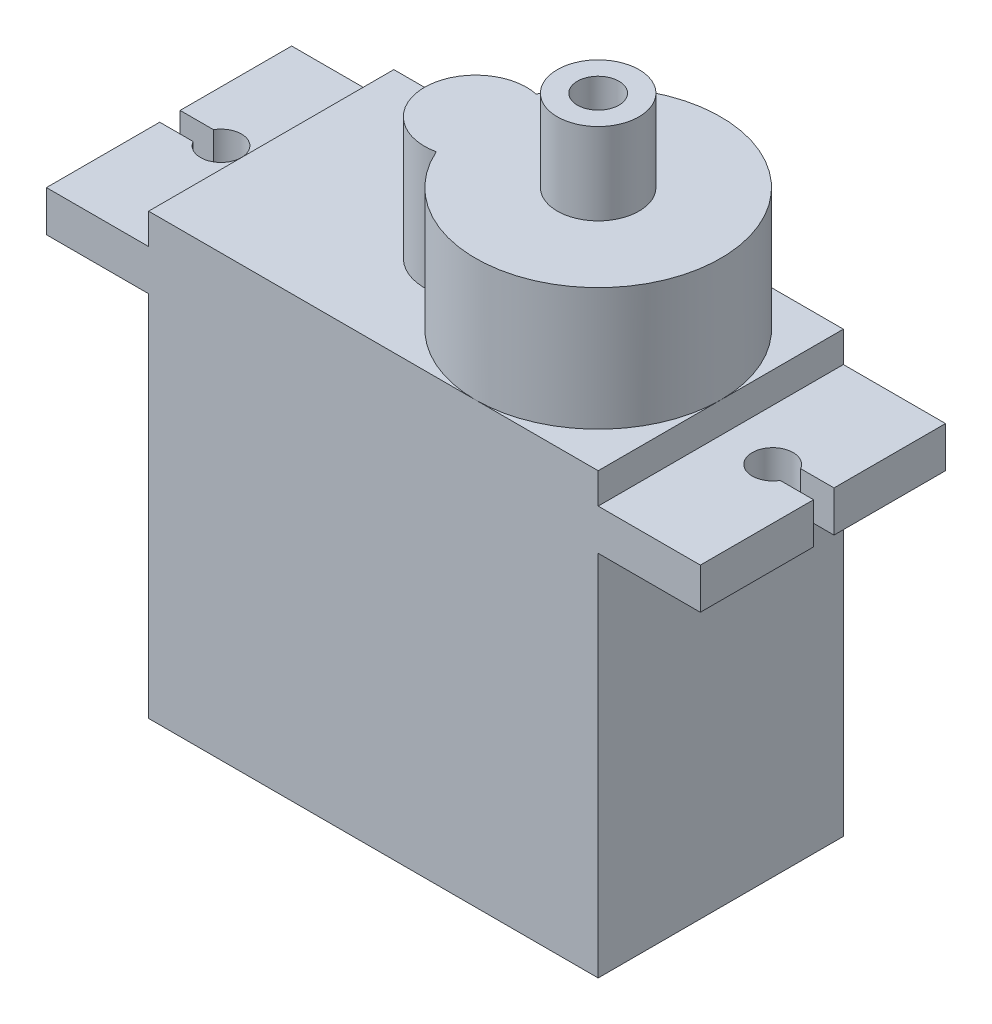
ISO-10303-21;
HEADER;
FILE_DESCRIPTION(('STEP AP214'),'2;1');
FILE_NAME('part.step','',(''),(''),'','','');
FILE_SCHEMA(('AUTOMOTIVE_DESIGN { 1 0 10303 214 1 1 1 1 }'));
ENDSEC;
DATA;
#1=APPLICATION_CONTEXT('core data for automotive mechanical design processes');
#2=APPLICATION_PROTOCOL_DEFINITION('international standard','automotive_design',2000,#1);
#3=PRODUCT_CONTEXT('',#1,'mechanical');
#4=PRODUCT('Part','Part','',(#3));
#5=PRODUCT_RELATED_PRODUCT_CATEGORY('part','',(#4));
#6=PRODUCT_DEFINITION_FORMATION('','',#4);
#7=PRODUCT_DEFINITION_CONTEXT('part definition',#1,'design');
#8=PRODUCT_DEFINITION('design','',#6,#7);
#9=PRODUCT_DEFINITION_SHAPE('','',#8);
#10=(LENGTH_UNIT() NAMED_UNIT(*) SI_UNIT(.MILLI.,.METRE.));
#11=(NAMED_UNIT(*) PLANE_ANGLE_UNIT() SI_UNIT($,.RADIAN.));
#12=(NAMED_UNIT(*) SI_UNIT($,.STERADIAN.) SOLID_ANGLE_UNIT());
#13=UNCERTAINTY_MEASURE_WITH_UNIT(LENGTH_MEASURE(1.E-05),#10,'distance_accuracy_value','');
#14=(GEOMETRIC_REPRESENTATION_CONTEXT(3) GLOBAL_UNCERTAINTY_ASSIGNED_CONTEXT((#13)) GLOBAL_UNIT_ASSIGNED_CONTEXT((#10,
#11,#12)) REPRESENTATION_CONTEXT('',''));
#15=CARTESIAN_POINT('',(0.,0.,0.));
#16=DIRECTION('',(0.,0.,1.));
#17=DIRECTION('',(1.,0.,0.));
#18=AXIS2_PLACEMENT_3D('',#15,#16,#17);
#19=CARTESIAN_POINT('',(16.,12.5368421052632,12.));
#20=DIRECTION('',(0.,1.,0.));
#21=DIRECTION('',(0.,0.,1.));
#22=AXIS2_PLACEMENT_3D('',#19,#20,#21);
#23=PLANE('',#22);
#24=DIRECTION('',(1.,0.,0.));
#25=VECTOR('',#24,1.);
#26=CARTESIAN_POINT('',(16.,12.5368421052632,5.45825614499163));
#27=LINE('',#26,#25);
#28=CARTESIAN_POINT('',(14.3660254037844,12.5368421052632,5.45825614499163));
#29=VERTEX_POINT('',#28);
#30=CARTESIAN_POINT('',(16.,12.5368421052632,5.45825614499163));
#31=VERTEX_POINT('',#30);
#32=EDGE_CURVE('E247',#29,#31,#27,.T.);
#33=ORIENTED_EDGE('',*,*,#32,.F.);
#34=CARTESIAN_POINT('',(13.5,12.5368421052632,5.95825614499163));
#35=DIRECTION('',(0.,1.,0.));
#36=DIRECTION('',(0.,0.,1.));
#37=AXIS2_PLACEMENT_3D('',#34,#35,#36);
#38=CIRCLE('',#37,1.);
#39=CARTESIAN_POINT('',(14.3660254037844,12.5368421052632,6.45825614499163));
#40=VERTEX_POINT('',#39);
#41=EDGE_CURVE('E199',#40,#29,#38,.F.);
#42=ORIENTED_EDGE('',*,*,#41,.F.);
#43=DIRECTION('',(-1.,0.,0.));
#44=VECTOR('',#43,1.);
#45=CARTESIAN_POINT('',(16.,12.5368421052632,6.45825614499163));
#46=LINE('',#45,#44);
#47=CARTESIAN_POINT('',(16.,12.5368421052632,6.45825614499163));
#48=VERTEX_POINT('',#47);
#49=EDGE_CURVE('E202',#48,#40,#46,.T.);
#50=ORIENTED_EDGE('',*,*,#49,.F.);
#51=DIRECTION('',(0.,0.,-1.));
#52=VECTOR('',#51,1.);
#53=CARTESIAN_POINT('',(16.,12.5368421052632,12.));
#54=LINE('',#53,#52);
#55=CARTESIAN_POINT('',(16.,12.5368421052632,12.));
#56=VERTEX_POINT('',#55);
#57=EDGE_CURVE('E362',#56,#48,#54,.T.);
#58=ORIENTED_EDGE('',*,*,#57,.F.);
#59=DIRECTION('',(1.,0.,0.));
#60=VECTOR('',#59,1.);
#61=CARTESIAN_POINT('',(16.,12.5368421052632,12.));
#62=LINE('',#61,#60);
#63=CARTESIAN_POINT('',(11.,12.5368421052632,12.));
#64=VERTEX_POINT('',#63);
#65=EDGE_CURVE('E284',#64,#56,#62,.T.);
#66=ORIENTED_EDGE('',*,*,#65,.F.);
#67=DIRECTION('',(0.,0.,-1.));
#68=VECTOR('',#67,1.);
#69=CARTESIAN_POINT('',(11.,12.5368421052632,12.));
#70=LINE('',#69,#68);
#71=CARTESIAN_POINT('',(11.,12.5368421052632,0.));
#72=VERTEX_POINT('',#71);
#73=EDGE_CURVE('E365',#64,#72,#70,.T.);
#74=ORIENTED_EDGE('',*,*,#73,.T.);
#75=DIRECTION('',(1.,0.,0.));
#76=VECTOR('',#75,1.);
#77=CARTESIAN_POINT('',(16.,12.5368421052632,0.));
#78=LINE('',#77,#76);
#79=CARTESIAN_POINT('',(16.,12.5368421052632,0.));
#80=VERTEX_POINT('',#79);
#81=EDGE_CURVE('E311',#72,#80,#78,.T.);
#82=ORIENTED_EDGE('',*,*,#81,.T.);
#83=EDGE_CURVE('E361',#31,#80,#54,.T.);
#84=ORIENTED_EDGE('',*,*,#83,.F.);
#85=EDGE_LOOP('',(#33,#42,#50,#58,#66,#74,#82,#84));
#86=FACE_BOUND('',#85,.T.);
#87=ADVANCED_FACE('F39',(#86),#23,.F.);
#88=CARTESIAN_POINT('',(16.,14.5368421052632,12.));
#89=DIRECTION('',(-1.,0.,0.));
#90=DIRECTION('',(0.,0.,1.));
#91=AXIS2_PLACEMENT_3D('',#88,#89,#90);
#92=PLANE('',#91);
#93=DIRECTION('',(0.,1.,0.));
#94=VECTOR('',#93,1.);
#95=CARTESIAN_POINT('',(16.,-5.46315789473684,5.45825614499163));
#96=LINE('',#95,#94);
#97=CARTESIAN_POINT('',(16.,14.5368421052632,5.45825614499163));
#98=VERTEX_POINT('',#97);
#99=EDGE_CURVE('E203',#31,#98,#96,.T.);
#100=ORIENTED_EDGE('',*,*,#99,.F.);
#101=ORIENTED_EDGE('',*,*,#83,.T.);
#102=DIRECTION('',(0.,1.,0.));
#103=VECTOR('',#102,1.);
#104=CARTESIAN_POINT('',(16.,14.5368421052632,0.));
#105=LINE('',#104,#103);
#106=CARTESIAN_POINT('',(16.,14.5368421052632,0.));
#107=VERTEX_POINT('',#106);
#108=EDGE_CURVE('E314',#80,#107,#105,.T.);
#109=ORIENTED_EDGE('',*,*,#108,.T.);
#110=DIRECTION('',(0.,0.,-1.));
#111=VECTOR('',#110,1.);
#112=CARTESIAN_POINT('',(16.,14.5368421052632,12.));
#113=LINE('',#112,#111);
#114=EDGE_CURVE('E358',#98,#107,#113,.T.);
#115=ORIENTED_EDGE('',*,*,#114,.F.);
#116=EDGE_LOOP('',(#100,#101,#109,#115));
#117=FACE_BOUND('',#116,.T.);
#118=ADVANCED_FACE('F453',(#117),#92,.F.);
#119=DIRECTION('',(0.,1.,0.));
#120=VECTOR('',#119,1.);
#121=CARTESIAN_POINT('',(16.,-5.46315789473684,6.45825614499163));
#122=LINE('',#121,#120);
#123=CARTESIAN_POINT('',(16.,14.5368421052632,6.45825614499163));
#124=VERTEX_POINT('',#123);
#125=EDGE_CURVE('E227',#48,#124,#122,.T.);
#126=ORIENTED_EDGE('',*,*,#125,.T.);
#127=CARTESIAN_POINT('',(16.,14.5368421052632,12.));
#128=VERTEX_POINT('',#127);
#129=EDGE_CURVE('E359',#128,#124,#113,.T.);
#130=ORIENTED_EDGE('',*,*,#129,.F.);
#131=DIRECTION('',(0.,1.,0.));
#132=VECTOR('',#131,1.);
#133=CARTESIAN_POINT('',(16.,14.5368421052632,12.));
#134=LINE('',#133,#132);
#135=EDGE_CURVE('E286',#56,#128,#134,.T.);
#136=ORIENTED_EDGE('',*,*,#135,.F.);
#137=ORIENTED_EDGE('',*,*,#57,.T.);
#138=EDGE_LOOP('',(#126,#130,#136,#137));
#139=FACE_BOUND('',#138,.T.);
#140=ADVANCED_FACE('F465',(#139),#92,.F.);
#141=CARTESIAN_POINT('',(16.,14.5368421052632,12.));
#142=DIRECTION('',(0.,-1.,0.));
#143=DIRECTION('',(1.,0.,0.));
#144=AXIS2_PLACEMENT_3D('',#141,#142,#143);
#145=PLANE('',#144);
#146=DIRECTION('',(1.,0.,0.));
#147=VECTOR('',#146,1.);
#148=CARTESIAN_POINT('',(14.3660254037844,14.5368421052632,5.45825614499163));
#149=LINE('',#148,#147);
#150=CARTESIAN_POINT('',(14.3660254037844,14.5368421052632,5.45825614499163));
#151=VERTEX_POINT('',#150);
#152=EDGE_CURVE('E206',#151,#98,#149,.T.);
#153=ORIENTED_EDGE('',*,*,#152,.T.);
#154=ORIENTED_EDGE('',*,*,#114,.T.);
#155=DIRECTION('',(-1.,0.,0.));
#156=VECTOR('',#155,1.);
#157=CARTESIAN_POINT('',(16.,14.5368421052632,0.));
#158=LINE('',#157,#156);
#159=CARTESIAN_POINT('',(11.,14.5368421052632,0.));
#160=VERTEX_POINT('',#159);
#161=EDGE_CURVE('E317',#107,#160,#158,.T.);
#162=ORIENTED_EDGE('',*,*,#161,.T.);
#163=DIRECTION('',(0.,0.,-1.));
#164=VECTOR('',#163,1.);
#165=CARTESIAN_POINT('',(11.,14.5368421052632,12.));
#166=LINE('',#165,#164);
#167=CARTESIAN_POINT('',(11.,14.5368421052632,12.));
#168=VERTEX_POINT('',#167);
#169=EDGE_CURVE('E355',#168,#160,#166,.T.);
#170=ORIENTED_EDGE('',*,*,#169,.F.);
#171=DIRECTION('',(-1.,0.,0.));
#172=VECTOR('',#171,1.);
#173=CARTESIAN_POINT('',(16.,14.5368421052632,12.));
#174=LINE('',#173,#172);
#175=EDGE_CURVE('E288',#128,#168,#174,.T.);
#176=ORIENTED_EDGE('',*,*,#175,.F.);
#177=ORIENTED_EDGE('',*,*,#129,.T.);
#178=DIRECTION('',(-1.,0.,0.));
#179=VECTOR('',#178,1.);
#180=CARTESIAN_POINT('',(14.3660254037844,14.5368421052632,6.45825614499163));
#181=LINE('',#180,#179);
#182=CARTESIAN_POINT('',(14.3660254037844,14.5368421052632,6.45825614499163));
#183=VERTEX_POINT('',#182);
#184=EDGE_CURVE('E211',#124,#183,#181,.T.);
#185=ORIENTED_EDGE('',*,*,#184,.T.);
#186=CARTESIAN_POINT('',(13.5,14.5368421052632,5.95825614499163));
#187=DIRECTION('',(0.,-1.,0.));
#188=DIRECTION('',(0.,0.,-1.));
#189=AXIS2_PLACEMENT_3D('',#186,#187,#188);
#190=CIRCLE('',#189,1.);
#191=EDGE_CURVE('E54',#183,#151,#190,.T.);
#192=ORIENTED_EDGE('',*,*,#191,.T.);
#193=EDGE_LOOP('',(#153,#154,#162,#170,#176,#177,#185,#192));
#194=FACE_BOUND('',#193,.T.);
#195=ADVANCED_FACE('F214',(#194),#145,.F.);
#196=CARTESIAN_POINT('',(-16.,14.5368421052632,12.));
#197=DIRECTION('',(1.,0.,0.));
#198=DIRECTION('',(0.,0.,-1.));
#199=AXIS2_PLACEMENT_3D('',#196,#197,#198);
#200=PLANE('',#199);
#201=DIRECTION('',(0.,1.,0.));
#202=VECTOR('',#201,1.);
#203=CARTESIAN_POINT('',(-16.0000000000001,-5.46315789473684,6.45825614499163));
#204=LINE('',#203,#202);
#205=CARTESIAN_POINT('',(-16.0000000000001,12.5368421052632,6.45825614499163));
#206=VERTEX_POINT('',#205);
#207=CARTESIAN_POINT('',(-16.0000000000001,14.5368421052632,6.45825614499163));
#208=VERTEX_POINT('',#207);
#209=EDGE_CURVE('E216',#206,#208,#204,.T.);
#210=ORIENTED_EDGE('',*,*,#209,.F.);
#211=DIRECTION('',(0.,0.,-1.));
#212=VECTOR('',#211,1.);
#213=CARTESIAN_POINT('',(-16.,12.5368421052632,12.));
#214=LINE('',#213,#212);
#215=CARTESIAN_POINT('',(-16.,12.5368421052632,12.));
#216=VERTEX_POINT('',#215);
#217=EDGE_CURVE('E338',#216,#206,#214,.T.);
#218=ORIENTED_EDGE('',*,*,#217,.F.);
#219=DIRECTION('',(0.,-1.,0.));
#220=VECTOR('',#219,1.);
#221=CARTESIAN_POINT('',(-16.,14.5368421052632,12.));
#222=LINE('',#221,#220);
#223=CARTESIAN_POINT('',(-16.,14.5368421052632,12.));
#224=VERTEX_POINT('',#223);
#225=EDGE_CURVE('E300',#224,#216,#222,.T.);
#226=ORIENTED_EDGE('',*,*,#225,.F.);
#227=DIRECTION('',(0.,0.,-1.));
#228=VECTOR('',#227,1.);
#229=CARTESIAN_POINT('',(-16.,14.5368421052632,12.));
#230=LINE('',#229,#228);
#231=EDGE_CURVE('E342',#224,#208,#230,.T.);
#232=ORIENTED_EDGE('',*,*,#231,.T.);
#233=EDGE_LOOP('',(#210,#218,#226,#232));
#234=FACE_BOUND('',#233,.T.);
#235=ADVANCED_FACE('F416',(#234),#200,.F.);
#236=DIRECTION('',(0.,1.,0.));
#237=VECTOR('',#236,1.);
#238=CARTESIAN_POINT('',(-16.,-5.46315789473684,5.45825614499163));
#239=LINE('',#238,#237);
#240=CARTESIAN_POINT('',(-16.,12.5368421052632,5.45825614499163));
#241=VERTEX_POINT('',#240);
#242=CARTESIAN_POINT('',(-16.,14.5368421052632,5.45825614499163));
#243=VERTEX_POINT('',#242);
#244=EDGE_CURVE('E218',#241,#243,#239,.T.);
#245=ORIENTED_EDGE('',*,*,#244,.T.);
#246=CARTESIAN_POINT('',(-16.,14.5368421052632,0.));
#247=VERTEX_POINT('',#246);
#248=EDGE_CURVE('E341',#243,#247,#230,.T.);
#249=ORIENTED_EDGE('',*,*,#248,.T.);
#250=DIRECTION('',(0.,-1.,0.));
#251=VECTOR('',#250,1.);
#252=CARTESIAN_POINT('',(-16.,14.5368421052632,0.));
#253=LINE('',#252,#251);
#254=CARTESIAN_POINT('',(-16.,12.5368421052632,0.));
#255=VERTEX_POINT('',#254);
#256=EDGE_CURVE('E331',#247,#255,#253,.T.);
#257=ORIENTED_EDGE('',*,*,#256,.T.);
#258=EDGE_CURVE('E337',#241,#255,#214,.T.);
#259=ORIENTED_EDGE('',*,*,#258,.F.);
#260=EDGE_LOOP('',(#245,#249,#257,#259));
#261=FACE_BOUND('',#260,.T.);
#262=ADVANCED_FACE('F394',(#261),#200,.F.);
#263=CARTESIAN_POINT('',(11.,16.0368421052632,12.));
#264=DIRECTION('',(0.,-1.,0.));
#265=DIRECTION('',(0.,0.,-1.));
#266=AXIS2_PLACEMENT_3D('',#263,#264,#265);
#267=PLANE('',#266);
#268=CARTESIAN_POINT('',(-1.,16.0368421052632,6.));
#269=DIRECTION('',(0.,1.,0.));
#270=DIRECTION('',(0.,0.,1.));
#271=AXIS2_PLACEMENT_3D('',#268,#269,#270);
#272=CIRCLE('',#271,2.5);
#273=CARTESIAN_POINT('',(-0.479166666666667,16.0368421052632,3.55485529285302));
#274=VERTEX_POINT('',#273);
#275=CARTESIAN_POINT('',(-0.479166666666667,16.0368421052632,8.44514470714698));
#276=VERTEX_POINT('',#275);
#277=EDGE_CURVE('E254',#274,#276,#272,.T.);
#278=ORIENTED_EDGE('',*,*,#277,.F.);
#279=CARTESIAN_POINT('',(5.,16.0368421052632,6.));
#280=DIRECTION('',(0.,1.,0.));
#281=DIRECTION('',(0.,0.,1.));
#282=AXIS2_PLACEMENT_3D('',#279,#280,#281);
#283=CIRCLE('',#282,6.);
#284=CARTESIAN_POINT('',(5.,16.0368421052632,0.));
#285=VERTEX_POINT('',#284);
#286=EDGE_CURVE('E269',#285,#274,#283,.T.);
#287=ORIENTED_EDGE('',*,*,#286,.F.);
#288=DIRECTION('',(-1.,0.,0.));
#289=VECTOR('',#288,1.);
#290=CARTESIAN_POINT('',(11.,16.0368421052632,0.));
#291=LINE('',#290,#289);
#292=CARTESIAN_POINT('',(-11.,16.0368421052632,0.));
#293=VERTEX_POINT('',#292);
#294=EDGE_CURVE('E322',#285,#293,#291,.T.);
#295=ORIENTED_EDGE('',*,*,#294,.T.);
#296=DIRECTION('',(0.,0.,-1.));
#297=VECTOR('',#296,1.);
#298=CARTESIAN_POINT('',(-11.,16.0368421052632,12.));
#299=LINE('',#298,#297);
#300=CARTESIAN_POINT('',(-11.,16.0368421052632,12.));
#301=VERTEX_POINT('',#300);
#302=EDGE_CURVE('E348',#301,#293,#299,.T.);
#303=ORIENTED_EDGE('',*,*,#302,.F.);
#304=DIRECTION('',(-1.,0.,0.));
#305=VECTOR('',#304,1.);
#306=CARTESIAN_POINT('',(11.,16.0368421052632,12.));
#307=LINE('',#306,#305);
#308=CARTESIAN_POINT('',(5.,16.0368421052632,12.));
#309=VERTEX_POINT('',#308);
#310=EDGE_CURVE('E292',#309,#301,#307,.T.);
#311=ORIENTED_EDGE('',*,*,#310,.F.);
#312=EDGE_CURVE('E261',#276,#309,#283,.T.);
#313=ORIENTED_EDGE('',*,*,#312,.F.);
#314=EDGE_LOOP('',(#278,#287,#295,#303,#311,#313));
#315=FACE_BOUND('',#314,.T.);
#316=ADVANCED_FACE('F444',(#315),#267,.F.);
#317=CARTESIAN_POINT('',(11.,16.0368421052632,6.));
#318=VERTEX_POINT('',#317);
#319=EDGE_CURVE('E268',#309,#318,#283,.T.);
#320=ORIENTED_EDGE('',*,*,#319,.F.);
#321=CARTESIAN_POINT('',(11.,16.0368421052632,12.));
#322=VERTEX_POINT('',#321);
#323=EDGE_CURVE('E293',#322,#309,#307,.T.);
#324=ORIENTED_EDGE('',*,*,#323,.F.);
#325=DIRECTION('',(0.,0.,-1.));
#326=VECTOR('',#325,1.);
#327=CARTESIAN_POINT('',(11.,16.0368421052632,12.));
#328=LINE('',#327,#326);
#329=EDGE_CURVE('E352',#322,#318,#328,.T.);
#330=ORIENTED_EDGE('',*,*,#329,.T.);
#331=EDGE_LOOP('',(#320,#324,#330));
#332=FACE_BOUND('',#331,.T.);
#333=ADVANCED_FACE('F442',(#332),#267,.F.);
#334=CARTESIAN_POINT('',(-11.,-5.46315789473684,12.));
#335=DIRECTION('',(1.,0.,0.));
#336=DIRECTION('',(0.,1.,0.));
#337=AXIS2_PLACEMENT_3D('',#334,#335,#336);
#338=PLANE('',#337);
#339=DIRECTION('',(0.,-1.,0.));
#340=VECTOR('',#339,1.);
#341=CARTESIAN_POINT('',(-11.,-5.46315789473684,0.));
#342=LINE('',#341,#340);
#343=CARTESIAN_POINT('',(-11.,12.5368421052632,0.));
#344=VERTEX_POINT('',#343);
#345=CARTESIAN_POINT('',(-11.,-5.46315789473684,0.));
#346=VERTEX_POINT('',#345);
#347=EDGE_CURVE('E275',#344,#346,#342,.T.);
#348=ORIENTED_EDGE('',*,*,#347,.T.);
#349=DIRECTION('',(0.,0.,-1.));
#350=VECTOR('',#349,1.);
#351=CARTESIAN_POINT('',(-11.,-5.46315789473684,12.));
#352=LINE('',#351,#350);
#353=CARTESIAN_POINT('',(-11.,-5.46315789473684,12.));
#354=VERTEX_POINT('',#353);
#355=EDGE_CURVE('E371',#354,#346,#352,.T.);
#356=ORIENTED_EDGE('',*,*,#355,.F.);
#357=DIRECTION('',(0.,-1.,0.));
#358=VECTOR('',#357,1.);
#359=CARTESIAN_POINT('',(-11.,-5.46315789473684,12.));
#360=LINE('',#359,#358);
#361=CARTESIAN_POINT('',(-11.,12.5368421052632,12.));
#362=VERTEX_POINT('',#361);
#363=EDGE_CURVE('E276',#362,#354,#360,.T.);
#364=ORIENTED_EDGE('',*,*,#363,.F.);
#365=DIRECTION('',(0.,0.,-1.));
#366=VECTOR('',#365,1.);
#367=CARTESIAN_POINT('',(-11.,12.5368421052632,12.));
#368=LINE('',#367,#366);
#369=EDGE_CURVE('E304',#362,#344,#368,.T.);
#370=ORIENTED_EDGE('',*,*,#369,.T.);
#371=EDGE_LOOP('',(#348,#356,#364,#370));
#372=FACE_BOUND('',#371,.T.);
#373=ADVANCED_FACE('F41',(#372),#338,.F.);
#374=CARTESIAN_POINT('',(11.,-5.46315789473683,12.));
#375=DIRECTION('',(0.,1.,0.));
#376=DIRECTION('',(-1.,0.,0.));
#377=AXIS2_PLACEMENT_3D('',#374,#375,#376);
#378=PLANE('',#377);
#379=CARTESIAN_POINT('',(5.00000000000002,-5.46315789473684,6.));
#380=DIRECTION('',(0.,1.,0.));
#381=DIRECTION('',(-1.,0.,0.));
#382=AXIS2_PLACEMENT_3D('',#379,#380,#381);
#383=CIRCLE('',#382,1.01760424898394);
#384=CARTESIAN_POINT('',(3.98239575101609,-5.46315789473684,6.));
#385=VERTEX_POINT('',#384);
#386=EDGE_CURVE('E235',#385,#385,#383,.T.);
#387=ORIENTED_EDGE('',*,*,#386,.T.);
#388=EDGE_LOOP('',(#387));
#389=FACE_BOUND('',#388,.T.);
#390=DIRECTION('',(1.,0.,0.));
#391=VECTOR('',#390,1.);
#392=CARTESIAN_POINT('',(11.,-5.46315789473683,0.));
#393=LINE('',#392,#391);
#394=CARTESIAN_POINT('',(11.,-5.46315789473683,0.));
#395=VERTEX_POINT('',#394);
#396=EDGE_CURVE('E307',#346,#395,#393,.T.);
#397=ORIENTED_EDGE('',*,*,#396,.T.);
#398=DIRECTION('',(0.,0.,-1.));
#399=VECTOR('',#398,1.);
#400=CARTESIAN_POINT('',(11.,-5.46315789473683,12.));
#401=LINE('',#400,#399);
#402=CARTESIAN_POINT('',(11.,-5.46315789473683,12.));
#403=VERTEX_POINT('',#402);
#404=EDGE_CURVE('E368',#403,#395,#401,.T.);
#405=ORIENTED_EDGE('',*,*,#404,.F.);
#406=DIRECTION('',(1.,0.,0.));
#407=VECTOR('',#406,1.);
#408=CARTESIAN_POINT('',(11.,-5.46315789473683,12.));
#409=LINE('',#408,#407);
#410=EDGE_CURVE('E279',#354,#403,#409,.T.);
#411=ORIENTED_EDGE('',*,*,#410,.F.);
#412=ORIENTED_EDGE('',*,*,#355,.T.);
#413=EDGE_LOOP('',(#397,#405,#411,#412));
#414=FACE_BOUND('',#413,.T.);
#415=ADVANCED_FACE('F409',(#389,#414),#378,.F.);
#416=CARTESIAN_POINT('',(11.,-5.46315789473683,12.));
#417=DIRECTION('',(-1.,0.,0.));
#418=DIRECTION('',(0.,0.,1.));
#419=AXIS2_PLACEMENT_3D('',#416,#417,#418);
#420=PLANE('',#419);
#421=DIRECTION('',(0.,1.,0.));
#422=VECTOR('',#421,1.);
#423=CARTESIAN_POINT('',(11.,-5.46315789473683,0.));
#424=LINE('',#423,#422);
#425=EDGE_CURVE('E309',#395,#72,#424,.T.);
#426=ORIENTED_EDGE('',*,*,#425,.T.);
#427=ORIENTED_EDGE('',*,*,#73,.F.);
#428=DIRECTION('',(0.,1.,0.));
#429=VECTOR('',#428,1.);
#430=CARTESIAN_POINT('',(11.,-5.46315789473683,12.));
#431=LINE('',#430,#429);
#432=EDGE_CURVE('E282',#403,#64,#431,.T.);
#433=ORIENTED_EDGE('',*,*,#432,.F.);
#434=ORIENTED_EDGE('',*,*,#404,.T.);
#435=EDGE_LOOP('',(#426,#427,#433,#434));
#436=FACE_BOUND('',#435,.T.);
#437=ADVANCED_FACE('F460',(#436),#420,.F.);
#438=CARTESIAN_POINT('',(11.,16.0368421052632,12.));
#439=DIRECTION('',(-1.,0.,0.));
#440=DIRECTION('',(0.,0.,1.));
#441=AXIS2_PLACEMENT_3D('',#438,#439,#440);
#442=PLANE('',#441);
#443=DIRECTION('',(0.,1.,0.));
#444=VECTOR('',#443,1.);
#445=CARTESIAN_POINT('',(11.,16.0368421052632,0.));
#446=LINE('',#445,#444);
#447=CARTESIAN_POINT('',(11.,16.0368421052632,0.));
#448=VERTEX_POINT('',#447);
#449=EDGE_CURVE('E319',#160,#448,#446,.T.);
#450=ORIENTED_EDGE('',*,*,#449,.T.);
#451=EDGE_CURVE('E351',#318,#448,#328,.T.);
#452=ORIENTED_EDGE('',*,*,#451,.F.);
#453=ORIENTED_EDGE('',*,*,#329,.F.);
#454=DIRECTION('',(0.,1.,0.));
#455=VECTOR('',#454,1.);
#456=CARTESIAN_POINT('',(11.,16.0368421052632,12.));
#457=LINE('',#456,#455);
#458=EDGE_CURVE('E290',#168,#322,#457,.T.);
#459=ORIENTED_EDGE('',*,*,#458,.F.);
#460=ORIENTED_EDGE('',*,*,#169,.T.);
#461=EDGE_LOOP('',(#450,#452,#453,#459,#460));
#462=FACE_BOUND('',#461,.T.);
#463=ADVANCED_FACE('F449',(#462),#442,.F.);
#464=EDGE_CURVE('E433',#318,#285,#283,.T.);
#465=ORIENTED_EDGE('',*,*,#464,.F.);
#466=ORIENTED_EDGE('',*,*,#451,.T.);
#467=EDGE_CURVE('E323',#448,#285,#291,.T.);
#468=ORIENTED_EDGE('',*,*,#467,.T.);
#469=EDGE_LOOP('',(#465,#466,#468));
#470=FACE_BOUND('',#469,.T.);
#471=ADVANCED_FACE('F432',(#470),#267,.F.);
#472=CARTESIAN_POINT('',(-11.,16.0368421052632,12.));
#473=DIRECTION('',(1.,0.,0.));
#474=DIRECTION('',(0.,0.,-1.));
#475=AXIS2_PLACEMENT_3D('',#472,#473,#474);
#476=PLANE('',#475);
#477=DIRECTION('',(0.,-1.,0.));
#478=VECTOR('',#477,1.);
#479=CARTESIAN_POINT('',(-11.,16.0368421052632,0.));
#480=LINE('',#479,#478);
#481=CARTESIAN_POINT('',(-11.,14.5368421052632,0.));
#482=VERTEX_POINT('',#481);
#483=EDGE_CURVE('E326',#293,#482,#480,.T.);
#484=ORIENTED_EDGE('',*,*,#483,.T.);
#485=DIRECTION('',(0.,0.,-1.));
#486=VECTOR('',#485,1.);
#487=CARTESIAN_POINT('',(-11.,14.5368421052632,12.));
#488=LINE('',#487,#486);
#489=CARTESIAN_POINT('',(-11.,14.5368421052632,12.));
#490=VERTEX_POINT('',#489);
#491=EDGE_CURVE('E345',#490,#482,#488,.T.);
#492=ORIENTED_EDGE('',*,*,#491,.F.);
#493=DIRECTION('',(0.,-1.,0.));
#494=VECTOR('',#493,1.);
#495=CARTESIAN_POINT('',(-11.,16.0368421052632,12.));
#496=LINE('',#495,#494);
#497=EDGE_CURVE('E296',#301,#490,#496,.T.);
#498=ORIENTED_EDGE('',*,*,#497,.F.);
#499=ORIENTED_EDGE('',*,*,#302,.T.);
#500=EDGE_LOOP('',(#484,#492,#498,#499));
#501=FACE_BOUND('',#500,.T.);
#502=ADVANCED_FACE('F424',(#501),#476,.F.);
#503=CARTESIAN_POINT('',(-11.,14.5368421052632,12.));
#504=DIRECTION('',(0.,-1.,0.));
#505=DIRECTION('',(0.,0.,-1.));
#506=AXIS2_PLACEMENT_3D('',#503,#504,#505);
#507=PLANE('',#506);
#508=DIRECTION('',(-1.,0.,0.));
#509=VECTOR('',#508,1.);
#510=CARTESIAN_POINT('',(-14.3660254037845,14.5368421052632,6.45825614499163));
#511=LINE('',#510,#509);
#512=CARTESIAN_POINT('',(-14.3660254037845,14.5368421052632,6.45825614499163));
#513=VERTEX_POINT('',#512);
#514=EDGE_CURVE('E231',#513,#208,#511,.T.);
#515=ORIENTED_EDGE('',*,*,#514,.T.);
#516=ORIENTED_EDGE('',*,*,#231,.F.);
#517=DIRECTION('',(-1.,0.,0.));
#518=VECTOR('',#517,1.);
#519=CARTESIAN_POINT('',(-11.,14.5368421052632,12.));
#520=LINE('',#519,#518);
#521=EDGE_CURVE('E298',#490,#224,#520,.T.);
#522=ORIENTED_EDGE('',*,*,#521,.F.);
#523=ORIENTED_EDGE('',*,*,#491,.T.);
#524=DIRECTION('',(-1.,0.,0.));
#525=VECTOR('',#524,1.);
#526=CARTESIAN_POINT('',(-11.,14.5368421052632,0.));
#527=LINE('',#526,#525);
#528=EDGE_CURVE('E328',#482,#247,#527,.T.);
#529=ORIENTED_EDGE('',*,*,#528,.T.);
#530=ORIENTED_EDGE('',*,*,#248,.F.);
#531=DIRECTION('',(1.,0.,0.));
#532=VECTOR('',#531,1.);
#533=CARTESIAN_POINT('',(-14.3660254037845,14.5368421052632,5.45825614499163));
#534=LINE('',#533,#532);
#535=CARTESIAN_POINT('',(-14.3660254037845,14.5368421052632,5.45825614499163));
#536=VERTEX_POINT('',#535);
#537=EDGE_CURVE('E234',#243,#536,#534,.T.);
#538=ORIENTED_EDGE('',*,*,#537,.T.);
#539=CARTESIAN_POINT('',(-13.5,14.5368421052632,5.95825614499163));
#540=DIRECTION('',(0.,-1.,0.));
#541=DIRECTION('',(0.,0.,1.));
#542=AXIS2_PLACEMENT_3D('',#539,#540,#541);
#543=CIRCLE('',#542,1.);
#544=EDGE_CURVE('E238',#536,#513,#543,.T.);
#545=ORIENTED_EDGE('',*,*,#544,.T.);
#546=EDGE_LOOP('',(#515,#516,#522,#523,#529,#530,#538,#545));
#547=FACE_BOUND('',#546,.T.);
#548=ADVANCED_FACE('F391',(#547),#507,.F.);
#549=CARTESIAN_POINT('',(-11.,12.5368421052632,12.));
#550=DIRECTION('',(0.,1.,0.));
#551=DIRECTION('',(0.,0.,1.));
#552=AXIS2_PLACEMENT_3D('',#549,#550,#551);
#553=PLANE('',#552);
#554=DIRECTION('',(-1.,0.,0.));
#555=VECTOR('',#554,1.);
#556=CARTESIAN_POINT('',(-11.,12.5368421052632,6.45825614499163));
#557=LINE('',#556,#555);
#558=CARTESIAN_POINT('',(-14.3660254037845,12.5368421052632,6.45825614499163));
#559=VERTEX_POINT('',#558);
#560=EDGE_CURVE('E11',#559,#206,#557,.T.);
#561=ORIENTED_EDGE('',*,*,#560,.F.);
#562=CARTESIAN_POINT('',(-13.5,12.5368421052632,5.95825614499163));
#563=DIRECTION('',(0.,1.,0.));
#564=DIRECTION('',(0.,0.,1.));
#565=AXIS2_PLACEMENT_3D('',#562,#563,#564);
#566=CIRCLE('',#565,1.);
#567=CARTESIAN_POINT('',(-14.3660254037845,12.5368421052632,5.45825614499163));
#568=VERTEX_POINT('',#567);
#569=EDGE_CURVE('E374',#568,#559,#566,.F.);
#570=ORIENTED_EDGE('',*,*,#569,.F.);
#571=DIRECTION('',(1.,0.,0.));
#572=VECTOR('',#571,1.);
#573=CARTESIAN_POINT('',(-11.,12.5368421052632,5.45825614499163));
#574=LINE('',#573,#572);
#575=EDGE_CURVE('E47',#241,#568,#574,.T.);
#576=ORIENTED_EDGE('',*,*,#575,.F.);
#577=ORIENTED_EDGE('',*,*,#258,.T.);
#578=DIRECTION('',(1.,0.,0.));
#579=VECTOR('',#578,1.);
#580=CARTESIAN_POINT('',(-11.,12.5368421052632,0.));
#581=LINE('',#580,#579);
#582=EDGE_CURVE('E280',#255,#344,#581,.T.);
#583=ORIENTED_EDGE('',*,*,#582,.T.);
#584=ORIENTED_EDGE('',*,*,#369,.F.);
#585=DIRECTION('',(1.,0.,0.));
#586=VECTOR('',#585,1.);
#587=CARTESIAN_POINT('',(-11.,12.5368421052632,12.));
#588=LINE('',#587,#586);
#589=EDGE_CURVE('E302',#216,#362,#588,.T.);
#590=ORIENTED_EDGE('',*,*,#589,.F.);
#591=ORIENTED_EDGE('',*,*,#217,.T.);
#592=EDGE_LOOP('',(#561,#570,#576,#577,#583,#584,#590,#591));
#593=FACE_BOUND('',#592,.T.);
#594=ADVANCED_FACE('F382',(#593),#553,.F.);
#595=CARTESIAN_POINT('',(0.,0.,12.));
#596=DIRECTION('',(0.,0.,1.));
#597=DIRECTION('',(1.,0.,0.));
#598=AXIS2_PLACEMENT_3D('',#595,#596,#597);
#599=PLANE('',#598);
#600=ORIENTED_EDGE('',*,*,#363,.T.);
#601=ORIENTED_EDGE('',*,*,#410,.T.);
#602=ORIENTED_EDGE('',*,*,#432,.T.);
#603=ORIENTED_EDGE('',*,*,#65,.T.);
#604=ORIENTED_EDGE('',*,*,#135,.T.);
#605=ORIENTED_EDGE('',*,*,#175,.T.);
#606=ORIENTED_EDGE('',*,*,#458,.T.);
#607=ORIENTED_EDGE('',*,*,#323,.T.);
#608=ORIENTED_EDGE('',*,*,#310,.T.);
#609=ORIENTED_EDGE('',*,*,#497,.T.);
#610=ORIENTED_EDGE('',*,*,#521,.T.);
#611=ORIENTED_EDGE('',*,*,#225,.T.);
#612=ORIENTED_EDGE('',*,*,#589,.T.);
#613=EDGE_LOOP('',(#600,#601,#602,#603,#604,#605,#606,#607,#608,#609,#610,#611,#612));
#614=FACE_BOUND('',#613,.T.);
#615=ADVANCED_FACE('F412',(#614),#599,.T.);
#616=CARTESIAN_POINT('',(0.,0.,0.));
#617=DIRECTION('',(0.,0.,1.));
#618=DIRECTION('',(1.,0.,0.));
#619=AXIS2_PLACEMENT_3D('',#616,#617,#618);
#620=PLANE('',#619);
#621=ORIENTED_EDGE('',*,*,#347,.F.);
#622=ORIENTED_EDGE('',*,*,#582,.F.);
#623=ORIENTED_EDGE('',*,*,#256,.F.);
#624=ORIENTED_EDGE('',*,*,#528,.F.);
#625=ORIENTED_EDGE('',*,*,#483,.F.);
#626=ORIENTED_EDGE('',*,*,#294,.F.);
#627=ORIENTED_EDGE('',*,*,#467,.F.);
#628=ORIENTED_EDGE('',*,*,#449,.F.);
#629=ORIENTED_EDGE('',*,*,#161,.F.);
#630=ORIENTED_EDGE('',*,*,#108,.F.);
#631=ORIENTED_EDGE('',*,*,#81,.F.);
#632=ORIENTED_EDGE('',*,*,#425,.F.);
#633=ORIENTED_EDGE('',*,*,#396,.F.);
#634=EDGE_LOOP('',(#621,#622,#623,#624,#625,#626,#627,#628,#629,#630,#631,#632,#633));
#635=FACE_BOUND('',#634,.T.);
#636=ADVANCED_FACE('F404',(#635),#620,.F.);
#637=CARTESIAN_POINT('',(-1.,22.0368421052632,6.));
#638=DIRECTION('',(0.,-1.,0.));
#639=DIRECTION('',(0.,0.,-1.));
#640=AXIS2_PLACEMENT_3D('',#637,#638,#639);
#641=CYLINDRICAL_SURFACE('',#640,2.5);
#642=ORIENTED_EDGE('',*,*,#277,.T.);
#643=DIRECTION('',(0.,-1.,0.));
#644=VECTOR('',#643,1.);
#645=CARTESIAN_POINT('',(-0.479166666666667,22.0368421052632,8.44514470714698));
#646=LINE('',#645,#644);
#647=CARTESIAN_POINT('',(-0.479166666666667,22.0368421052632,8.44514470714698));
#648=VERTEX_POINT('',#647);
#649=EDGE_CURVE('E272',#648,#276,#646,.T.);
#650=ORIENTED_EDGE('',*,*,#649,.F.);
#651=CARTESIAN_POINT('',(-1.,22.0368421052632,6.));
#652=DIRECTION('',(0.,1.,0.));
#653=DIRECTION('',(0.,0.,1.));
#654=AXIS2_PLACEMENT_3D('',#651,#652,#653);
#655=CIRCLE('',#654,2.5);
#656=CARTESIAN_POINT('',(-0.479166666666667,22.0368421052632,3.55485529285302));
#657=VERTEX_POINT('',#656);
#658=EDGE_CURVE('E257',#657,#648,#655,.T.);
#659=ORIENTED_EDGE('',*,*,#658,.F.);
#660=DIRECTION('',(0.,-1.,0.));
#661=VECTOR('',#660,1.);
#662=CARTESIAN_POINT('',(-0.479166666666667,22.0368421052632,3.55485529285302));
#663=LINE('',#662,#661);
#664=EDGE_CURVE('E263',#657,#274,#663,.T.);
#665=ORIENTED_EDGE('',*,*,#664,.T.);
#666=EDGE_LOOP('',(#642,#650,#659,#665));
#667=FACE_BOUND('',#666,.T.);
#668=ADVANCED_FACE('F517',(#667),#641,.T.);
#669=CARTESIAN_POINT('',(5.,22.0368421052632,6.));
#670=DIRECTION('',(0.,-1.,0.));
#671=DIRECTION('',(0.,0.,-1.));
#672=AXIS2_PLACEMENT_3D('',#669,#670,#671);
#673=CYLINDRICAL_SURFACE('',#672,6.);
#674=ORIENTED_EDGE('',*,*,#312,.T.);
#675=ORIENTED_EDGE('',*,*,#319,.T.);
#676=ORIENTED_EDGE('',*,*,#464,.T.);
#677=ORIENTED_EDGE('',*,*,#286,.T.);
#678=ORIENTED_EDGE('',*,*,#664,.F.);
#679=CARTESIAN_POINT('',(5.,22.0368421052632,6.));
#680=DIRECTION('',(0.,1.,0.));
#681=DIRECTION('',(0.,0.,1.));
#682=AXIS2_PLACEMENT_3D('',#679,#680,#681);
#683=CIRCLE('',#682,6.);
#684=EDGE_CURVE('E260',#648,#657,#683,.T.);
#685=ORIENTED_EDGE('',*,*,#684,.F.);
#686=ORIENTED_EDGE('',*,*,#649,.T.);
#687=EDGE_LOOP('',(#674,#675,#676,#677,#678,#685,#686));
#688=FACE_BOUND('',#687,.T.);
#689=ADVANCED_FACE('F438',(#688),#673,.T.);
#690=CARTESIAN_POINT('',(2.,22.0368421052632,6.));
#691=DIRECTION('',(0.,1.,0.));
#692=DIRECTION('',(0.,0.,1.));
#693=AXIS2_PLACEMENT_3D('',#690,#691,#692);
#694=PLANE('',#693);
#695=CARTESIAN_POINT('',(5.,22.0368421052632,6.));
#696=DIRECTION('',(0.,1.,0.));
#697=DIRECTION('',(-1.,0.,0.));
#698=AXIS2_PLACEMENT_3D('',#695,#696,#697);
#699=CIRCLE('',#698,2.);
#700=CARTESIAN_POINT('',(3.,22.0368421052632,6.));
#701=VERTEX_POINT('',#700);
#702=EDGE_CURVE('E250',#701,#701,#699,.T.);
#703=ORIENTED_EDGE('',*,*,#702,.F.);
#704=EDGE_LOOP('',(#703));
#705=FACE_BOUND('',#704,.T.);
#706=ORIENTED_EDGE('',*,*,#658,.T.);
#707=ORIENTED_EDGE('',*,*,#684,.T.);
#708=EDGE_LOOP('',(#706,#707));
#709=FACE_BOUND('',#708,.T.);
#710=ADVANCED_FACE('F507',(#705,#709),#694,.T.);
#711=CARTESIAN_POINT('',(5.,26.0368421052632,6.));
#712=DIRECTION('',(0.,-1.,0.));
#713=DIRECTION('',(1.,0.,0.));
#714=AXIS2_PLACEMENT_3D('',#711,#712,#713);
#715=CYLINDRICAL_SURFACE('',#714,2.);
#716=CARTESIAN_POINT('',(5.,26.0368421052632,6.));
#717=DIRECTION('',(0.,1.,0.));
#718=DIRECTION('',(-1.,0.,0.));
#719=AXIS2_PLACEMENT_3D('',#716,#717,#718);
#720=CIRCLE('',#719,2.);
#721=CARTESIAN_POINT('',(3.,26.0368421052632,6.));
#722=VERTEX_POINT('',#721);
#723=EDGE_CURVE('E251',#722,#722,#720,.T.);
#724=ORIENTED_EDGE('',*,*,#723,.F.);
#725=EDGE_LOOP('',(#724));
#726=FACE_BOUND('',#725,.T.);
#727=ORIENTED_EDGE('',*,*,#702,.T.);
#728=EDGE_LOOP('',(#727));
#729=FACE_BOUND('',#728,.T.);
#730=ADVANCED_FACE('F501',(#726,#729),#715,.T.);
#731=CARTESIAN_POINT('',(5.,26.0368421052632,6.));
#732=DIRECTION('',(0.,1.,0.));
#733=DIRECTION('',(-1.,0.,0.));
#734=AXIS2_PLACEMENT_3D('',#731,#732,#733);
#735=PLANE('',#734);
#736=CARTESIAN_POINT('',(5.,26.0368421052632,6.));
#737=DIRECTION('',(0.,1.,0.));
#738=DIRECTION('',(-1.,0.,0.));
#739=AXIS2_PLACEMENT_3D('',#736,#737,#738);
#740=CIRCLE('',#739,1.01760424898394);
#741=CARTESIAN_POINT('',(3.98239575101606,26.0368421052632,6.));
#742=VERTEX_POINT('',#741);
#743=EDGE_CURVE('E221',#742,#742,#740,.T.);
#744=ORIENTED_EDGE('',*,*,#743,.F.);
#745=EDGE_LOOP('',(#744));
#746=FACE_BOUND('',#745,.T.);
#747=ORIENTED_EDGE('',*,*,#723,.T.);
#748=EDGE_LOOP('',(#747));
#749=FACE_BOUND('',#748,.T.);
#750=ADVANCED_FACE('F499',(#746,#749),#735,.T.);
#751=CARTESIAN_POINT('',(-14.3660254037845,-5.46315789473684,6.45825614499163));
#752=DIRECTION('',(0.,0.,-1.));
#753=DIRECTION('',(-1.,0.,0.));
#754=AXIS2_PLACEMENT_3D('',#751,#752,#753);
#755=PLANE('',#754);
#756=ORIENTED_EDGE('',*,*,#560,.T.);
#757=ORIENTED_EDGE('',*,*,#209,.T.);
#758=ORIENTED_EDGE('',*,*,#514,.F.);
#759=DIRECTION('',(0.,1.,0.));
#760=VECTOR('',#759,1.);
#761=CARTESIAN_POINT('',(-14.3660254037845,-5.46315789473684,6.45825614499163));
#762=LINE('',#761,#760);
#763=EDGE_CURVE('E241',#559,#513,#762,.T.);
#764=ORIENTED_EDGE('',*,*,#763,.F.);
#765=EDGE_LOOP('',(#756,#757,#758,#764));
#766=FACE_BOUND('',#765,.T.);
#767=ADVANCED_FACE('F387',(#766),#755,.T.);
#768=CARTESIAN_POINT('',(-14.3660254037845,-5.46315789473684,5.45825614499163));
#769=DIRECTION('',(0.,0.,1.));
#770=DIRECTION('',(1.,0.,0.));
#771=AXIS2_PLACEMENT_3D('',#768,#769,#770);
#772=PLANE('',#771);
#773=ORIENTED_EDGE('',*,*,#575,.T.);
#774=DIRECTION('',(0.,1.,0.));
#775=VECTOR('',#774,1.);
#776=CARTESIAN_POINT('',(-14.3660254037845,-5.46315789473684,5.45825614499163));
#777=LINE('',#776,#775);
#778=EDGE_CURVE('E62',#568,#536,#777,.T.);
#779=ORIENTED_EDGE('',*,*,#778,.T.);
#780=ORIENTED_EDGE('',*,*,#537,.F.);
#781=ORIENTED_EDGE('',*,*,#244,.F.);
#782=EDGE_LOOP('',(#773,#779,#780,#781));
#783=FACE_BOUND('',#782,.T.);
#784=ADVANCED_FACE('F378',(#783),#772,.T.);
#785=CARTESIAN_POINT('',(-13.5,-5.46315789473684,5.95825614499163));
#786=DIRECTION('',(0.,1.,0.));
#787=DIRECTION('',(0.,0.,1.));
#788=AXIS2_PLACEMENT_3D('',#785,#786,#787);
#789=CYLINDRICAL_SURFACE('',#788,1.);
#790=ORIENTED_EDGE('',*,*,#569,.T.);
#791=ORIENTED_EDGE('',*,*,#763,.T.);
#792=ORIENTED_EDGE('',*,*,#544,.F.);
#793=ORIENTED_EDGE('',*,*,#778,.F.);
#794=EDGE_LOOP('',(#790,#791,#792,#793));
#795=FACE_BOUND('',#794,.T.);
#796=ADVANCED_FACE('F384',(#795),#789,.F.);
#797=CARTESIAN_POINT('',(13.5,-5.46315789473684,5.95825614499163));
#798=DIRECTION('',(0.,1.,0.));
#799=DIRECTION('',(0.,0.,1.));
#800=AXIS2_PLACEMENT_3D('',#797,#798,#799);
#801=CYLINDRICAL_SURFACE('',#800,1.);
#802=ORIENTED_EDGE('',*,*,#41,.T.);
#803=DIRECTION('',(0.,1.,0.));
#804=VECTOR('',#803,1.);
#805=CARTESIAN_POINT('',(14.3660254037844,-5.46315789473684,5.45825614499163));
#806=LINE('',#805,#804);
#807=EDGE_CURVE('E195',#29,#151,#806,.T.);
#808=ORIENTED_EDGE('',*,*,#807,.T.);
#809=ORIENTED_EDGE('',*,*,#191,.F.);
#810=DIRECTION('',(0.,1.,0.));
#811=VECTOR('',#810,1.);
#812=CARTESIAN_POINT('',(14.3660254037844,-5.46315789473684,6.45825614499163));
#813=LINE('',#812,#811);
#814=EDGE_CURVE('E225',#40,#183,#813,.T.);
#815=ORIENTED_EDGE('',*,*,#814,.F.);
#816=EDGE_LOOP('',(#802,#808,#809,#815));
#817=FACE_BOUND('',#816,.T.);
#818=ADVANCED_FACE('F197',(#817),#801,.F.);
#819=CARTESIAN_POINT('',(14.3660254037844,-5.46315789473684,5.45825614499163));
#820=DIRECTION('',(0.,0.,1.));
#821=DIRECTION('',(1.,0.,0.));
#822=AXIS2_PLACEMENT_3D('',#819,#820,#821);
#823=PLANE('',#822);
#824=ORIENTED_EDGE('',*,*,#32,.T.);
#825=ORIENTED_EDGE('',*,*,#99,.T.);
#826=ORIENTED_EDGE('',*,*,#152,.F.);
#827=ORIENTED_EDGE('',*,*,#807,.F.);
#828=EDGE_LOOP('',(#824,#825,#826,#827));
#829=FACE_BOUND('',#828,.T.);
#830=ADVANCED_FACE('F207',(#829),#823,.T.);
#831=CARTESIAN_POINT('',(14.3660254037844,-5.46315789473684,6.45825614499163));
#832=DIRECTION('',(0.,0.,-1.));
#833=DIRECTION('',(-1.,0.,0.));
#834=AXIS2_PLACEMENT_3D('',#831,#832,#833);
#835=PLANE('',#834);
#836=ORIENTED_EDGE('',*,*,#49,.T.);
#837=ORIENTED_EDGE('',*,*,#814,.T.);
#838=ORIENTED_EDGE('',*,*,#184,.F.);
#839=ORIENTED_EDGE('',*,*,#125,.F.);
#840=EDGE_LOOP('',(#836,#837,#838,#839));
#841=FACE_BOUND('',#840,.T.);
#842=ADVANCED_FACE('F467',(#841),#835,.T.);
#843=CARTESIAN_POINT('',(5.00000000000002,-5.46315789473684,6.));
#844=DIRECTION('',(0.,1.,0.));
#845=DIRECTION('',(-1.,0.,0.));
#846=AXIS2_PLACEMENT_3D('',#843,#844,#845);
#847=CYLINDRICAL_SURFACE('',#846,1.01760424898394);
#848=ORIENTED_EDGE('',*,*,#386,.F.);
#849=EDGE_LOOP('',(#848));
#850=FACE_BOUND('',#849,.T.);
#851=ORIENTED_EDGE('',*,*,#743,.T.);
#852=EDGE_LOOP('',(#851));
#853=FACE_BOUND('',#852,.T.);
#854=ADVANCED_FACE('F469',(#850,#853),#847,.F.);
#855=CLOSED_SHELL('',(#87,#118,#140,#195,#235,#262,#316,#333,#373,#415,#437,#463,#471,#502,#548,
#594,#615,#636,#668,#689,#710,#730,#750,#767,#784,#796,#818,#830,#842,#854));
#856=MANIFOLD_SOLID_BREP('B2',#855);
#857=ADVANCED_BREP_SHAPE_REPRESENTATION('',(#18,#856),#14);
#858=SHAPE_DEFINITION_REPRESENTATION(#9,#857);
ENDSEC;
END-ISO-10303-21;
